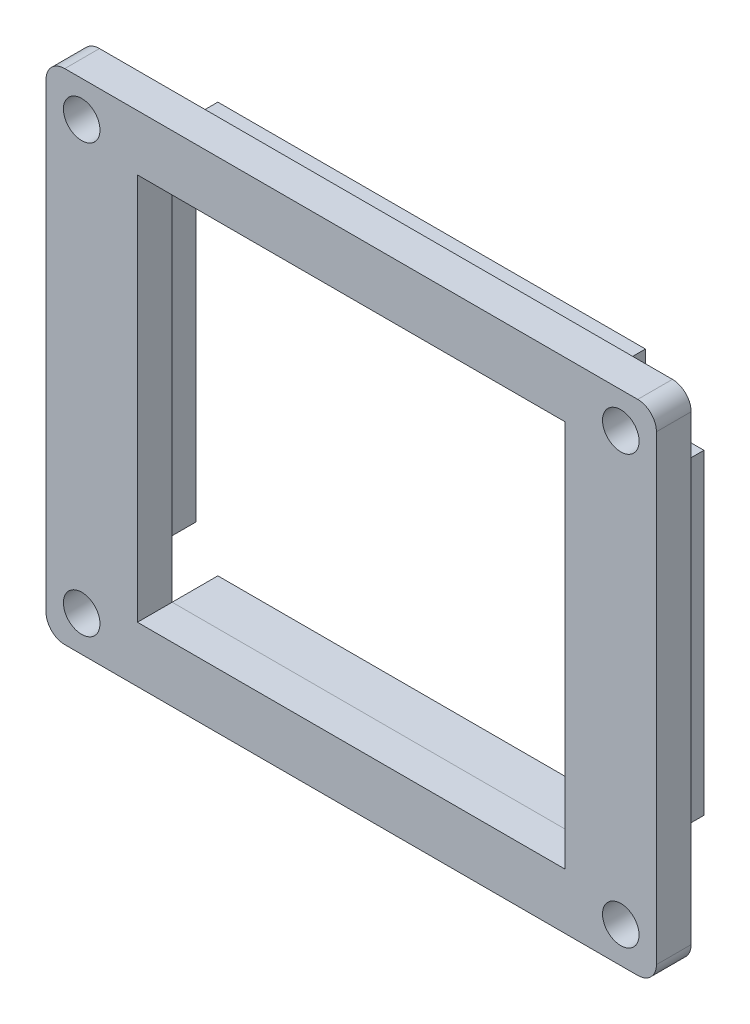
ISO-10303-21;
HEADER;
FILE_DESCRIPTION(('STEP AP214'),'2;1');
FILE_NAME('part.step','',(''),(''),'','','');
FILE_SCHEMA(('AUTOMOTIVE_DESIGN { 1 0 10303 214 1 1 1 1 }'));
ENDSEC;
DATA;
#1=APPLICATION_CONTEXT('core data for automotive mechanical design processes');
#2=APPLICATION_PROTOCOL_DEFINITION('international standard','automotive_design',2000,#1);
#3=PRODUCT_CONTEXT('',#1,'mechanical');
#4=PRODUCT('Part','Part','',(#3));
#5=PRODUCT_RELATED_PRODUCT_CATEGORY('part','',(#4));
#6=PRODUCT_DEFINITION_FORMATION('','',#4);
#7=PRODUCT_DEFINITION_CONTEXT('part definition',#1,'design');
#8=PRODUCT_DEFINITION('design','',#6,#7);
#9=PRODUCT_DEFINITION_SHAPE('','',#8);
#10=(LENGTH_UNIT() NAMED_UNIT(*) SI_UNIT(.MILLI.,.METRE.));
#11=(NAMED_UNIT(*) PLANE_ANGLE_UNIT() SI_UNIT($,.RADIAN.));
#12=(NAMED_UNIT(*) SI_UNIT($,.STERADIAN.) SOLID_ANGLE_UNIT());
#13=UNCERTAINTY_MEASURE_WITH_UNIT(LENGTH_MEASURE(1.E-05),#10,'distance_accuracy_value','');
#14=(GEOMETRIC_REPRESENTATION_CONTEXT(3) GLOBAL_UNCERTAINTY_ASSIGNED_CONTEXT((#13)) GLOBAL_UNIT_ASSIGNED_CONTEXT((#10,
#11,#12)) REPRESENTATION_CONTEXT('',''));
#15=CARTESIAN_POINT('',(0.,0.,0.));
#16=DIRECTION('',(0.,0.,1.));
#17=DIRECTION('',(1.,0.,0.));
#18=AXIS2_PLACEMENT_3D('',#15,#16,#17);
#19=CARTESIAN_POINT('',(0.,0.,-4.826));
#20=DIRECTION('',(0.,0.,-1.));
#21=DIRECTION('',(-1.,0.,0.));
#22=AXIS2_PLACEMENT_3D('',#19,#20,#21);
#23=PLANE('',#22);
#24=DIRECTION('',(0.,1.,0.));
#25=VECTOR('',#24,1.);
#26=CARTESIAN_POINT('',(-29.718,-26.924,-4.826));
#27=LINE('',#26,#25);
#28=CARTESIAN_POINT('',(-29.718,-26.924,-4.826));
#29=VERTEX_POINT('',#28);
#30=CARTESIAN_POINT('',(-29.718,26.924,-4.826));
#31=VERTEX_POINT('',#30);
#32=EDGE_CURVE('E224',#29,#31,#27,.T.);
#33=ORIENTED_EDGE('',*,*,#32,.F.);
#34=DIRECTION('',(0.,1.,0.));
#35=VECTOR('',#34,1.);
#36=CARTESIAN_POINT('',(-29.718,-30.099,-4.826));
#37=LINE('',#36,#35);
#38=CARTESIAN_POINT('',(-29.718,-30.099,-4.826));
#39=VERTEX_POINT('',#38);
#40=EDGE_CURVE('E268',#39,#29,#37,.T.);
#41=ORIENTED_EDGE('',*,*,#40,.F.);
#42=DIRECTION('',(-1.,0.,0.));
#43=VECTOR('',#42,1.);
#44=CARTESIAN_POINT('',(-29.718,-30.099,-4.826));
#45=LINE('',#44,#43);
#46=CARTESIAN_POINT('',(29.718,-30.099,-4.826));
#47=VERTEX_POINT('',#46);
#48=EDGE_CURVE('E284',#47,#39,#45,.T.);
#49=ORIENTED_EDGE('',*,*,#48,.F.);
#50=DIRECTION('',(0.,-1.,0.));
#51=VECTOR('',#50,1.);
#52=CARTESIAN_POINT('',(29.718,-30.099,-4.826));
#53=LINE('',#52,#51);
#54=CARTESIAN_POINT('',(29.718,-26.924,-4.826));
#55=VERTEX_POINT('',#54);
#56=EDGE_CURVE('E281',#55,#47,#53,.T.);
#57=ORIENTED_EDGE('',*,*,#56,.F.);
#58=DIRECTION('',(0.,-1.,0.));
#59=VECTOR('',#58,1.);
#60=CARTESIAN_POINT('',(29.718,-26.924,-4.826));
#61=LINE('',#60,#59);
#62=CARTESIAN_POINT('',(29.718,26.924,-4.826));
#63=VERTEX_POINT('',#62);
#64=EDGE_CURVE('E242',#63,#55,#61,.T.);
#65=ORIENTED_EDGE('',*,*,#64,.F.);
#66=DIRECTION('',(0.,-1.,0.));
#67=VECTOR('',#66,1.);
#68=CARTESIAN_POINT('',(29.718,30.099,-4.826));
#69=LINE('',#68,#67);
#70=CARTESIAN_POINT('',(29.718,30.099,-4.826));
#71=VERTEX_POINT('',#70);
#72=EDGE_CURVE('E349',#71,#63,#69,.T.);
#73=ORIENTED_EDGE('',*,*,#72,.F.);
#74=DIRECTION('',(1.,0.,0.));
#75=VECTOR('',#74,1.);
#76=CARTESIAN_POINT('',(-29.718,30.099,-4.826));
#77=LINE('',#76,#75);
#78=CARTESIAN_POINT('',(-29.718,30.099,-4.826));
#79=VERTEX_POINT('',#78);
#80=EDGE_CURVE('E365',#79,#71,#77,.T.);
#81=ORIENTED_EDGE('',*,*,#80,.F.);
#82=DIRECTION('',(0.,1.,0.));
#83=VECTOR('',#82,1.);
#84=CARTESIAN_POINT('',(-29.718,30.099,-4.826));
#85=LINE('',#84,#83);
#86=EDGE_CURVE('E362',#31,#79,#85,.T.);
#87=ORIENTED_EDGE('',*,*,#86,.F.);
#88=EDGE_LOOP('',(#33,#41,#49,#57,#65,#73,#81,#87));
#89=FACE_BOUND('',#88,.T.);
#90=CARTESIAN_POINT('',(37.465,29.718,-4.826));
#91=DIRECTION('',(0.,0.,1.));
#92=DIRECTION('',(-1.,0.,0.));
#93=AXIS2_PLACEMENT_3D('',#90,#91,#92);
#94=CIRCLE('',#93,2.54);
#95=CARTESIAN_POINT('',(34.925,29.718,-4.826));
#96=VERTEX_POINT('',#95);
#97=EDGE_CURVE('E444',#96,#96,#94,.T.);
#98=ORIENTED_EDGE('',*,*,#97,.T.);
#99=EDGE_LOOP('',(#98));
#100=FACE_BOUND('',#99,.T.);
#101=CARTESIAN_POINT('',(-37.465,-29.718,-4.826));
#102=DIRECTION('',(0.,0.,1.));
#103=DIRECTION('',(-1.,0.,0.));
#104=AXIS2_PLACEMENT_3D('',#101,#102,#103);
#105=CIRCLE('',#104,2.54);
#106=CARTESIAN_POINT('',(-40.005,-29.718,-4.826));
#107=VERTEX_POINT('',#106);
#108=EDGE_CURVE('E436',#107,#107,#105,.T.);
#109=ORIENTED_EDGE('',*,*,#108,.T.);
#110=EDGE_LOOP('',(#109));
#111=FACE_BOUND('',#110,.T.);
#112=CARTESIAN_POINT('',(37.465,-29.718,-4.826));
#113=DIRECTION('',(0.,0.,1.));
#114=DIRECTION('',(1.,0.,0.));
#115=AXIS2_PLACEMENT_3D('',#112,#113,#114);
#116=CIRCLE('',#115,2.54);
#117=CARTESIAN_POINT('',(40.005,-29.718,-4.826));
#118=VERTEX_POINT('',#117);
#119=EDGE_CURVE('E427',#118,#118,#116,.T.);
#120=ORIENTED_EDGE('',*,*,#119,.T.);
#121=EDGE_LOOP('',(#120));
#122=FACE_BOUND('',#121,.T.);
#123=CARTESIAN_POINT('',(-37.465,29.718,-4.826));
#124=DIRECTION('',(0.,0.,1.));
#125=DIRECTION('',(1.,0.,0.));
#126=AXIS2_PLACEMENT_3D('',#123,#124,#125);
#127=CIRCLE('',#126,2.54);
#128=CARTESIAN_POINT('',(-34.925,29.718,-4.826));
#129=VERTEX_POINT('',#128);
#130=EDGE_CURVE('E451',#129,#129,#127,.T.);
#131=ORIENTED_EDGE('',*,*,#130,.T.);
#132=EDGE_LOOP('',(#131));
#133=FACE_BOUND('',#132,.T.);
#134=DIRECTION('',(1.,0.,0.));
#135=VECTOR('',#134,1.);
#136=CARTESIAN_POINT('',(-42.418,-34.671,-4.826));
#137=LINE('',#136,#135);
#138=CARTESIAN_POINT('',(-39.818,-34.671,-4.826));
#139=VERTEX_POINT('',#138);
#140=CARTESIAN_POINT('',(39.818,-34.671,-4.826));
#141=VERTEX_POINT('',#140);
#142=EDGE_CURVE('E463',#139,#141,#137,.T.);
#143=ORIENTED_EDGE('',*,*,#142,.F.);
#144=CARTESIAN_POINT('',(-39.818,-32.071,-4.826));
#145=DIRECTION('',(0.,0.,-1.));
#146=DIRECTION('',(-1.,0.,0.));
#147=AXIS2_PLACEMENT_3D('',#144,#145,#146);
#148=CIRCLE('',#147,2.6);
#149=CARTESIAN_POINT('',(-42.418,-32.071,-4.826));
#150=VERTEX_POINT('',#149);
#151=EDGE_CURVE('E525',#139,#150,#148,.T.);
#152=ORIENTED_EDGE('',*,*,#151,.T.);
#153=DIRECTION('',(0.,-1.,0.));
#154=VECTOR('',#153,1.);
#155=CARTESIAN_POINT('',(-42.418,-34.671,-4.826));
#156=LINE('',#155,#154);
#157=CARTESIAN_POINT('',(-42.418,32.071,-4.826));
#158=VERTEX_POINT('',#157);
#159=EDGE_CURVE('E459',#158,#150,#156,.T.);
#160=ORIENTED_EDGE('',*,*,#159,.F.);
#161=CARTESIAN_POINT('',(-39.818,32.071,-4.826));
#162=DIRECTION('',(0.,0.,-1.));
#163=DIRECTION('',(-1.,0.,0.));
#164=AXIS2_PLACEMENT_3D('',#161,#162,#163);
#165=CIRCLE('',#164,2.6);
#166=CARTESIAN_POINT('',(-39.818,34.671,-4.826));
#167=VERTEX_POINT('',#166);
#168=EDGE_CURVE('E516',#158,#167,#165,.T.);
#169=ORIENTED_EDGE('',*,*,#168,.T.);
#170=DIRECTION('',(-1.,0.,0.));
#171=VECTOR('',#170,1.);
#172=CARTESIAN_POINT('',(-42.418,34.671,-4.826));
#173=LINE('',#172,#171);
#174=CARTESIAN_POINT('',(39.818,34.671,-4.826));
#175=VERTEX_POINT('',#174);
#176=EDGE_CURVE('E472',#175,#167,#173,.T.);
#177=ORIENTED_EDGE('',*,*,#176,.F.);
#178=CARTESIAN_POINT('',(39.818,32.071,-4.826));
#179=DIRECTION('',(0.,0.,-1.));
#180=DIRECTION('',(-1.,0.,0.));
#181=AXIS2_PLACEMENT_3D('',#178,#179,#180);
#182=CIRCLE('',#181,2.6);
#183=CARTESIAN_POINT('',(42.418,32.071,-4.826));
#184=VERTEX_POINT('',#183);
#185=EDGE_CURVE('E519',#175,#184,#182,.T.);
#186=ORIENTED_EDGE('',*,*,#185,.T.);
#187=DIRECTION('',(0.,1.,0.));
#188=VECTOR('',#187,1.);
#189=CARTESIAN_POINT('',(42.418,-34.671,-4.826));
#190=LINE('',#189,#188);
#191=CARTESIAN_POINT('',(42.418,-32.071,-4.826));
#192=VERTEX_POINT('',#191);
#193=EDGE_CURVE('E468',#192,#184,#190,.T.);
#194=ORIENTED_EDGE('',*,*,#193,.F.);
#195=CARTESIAN_POINT('',(39.818,-32.071,-4.826));
#196=DIRECTION('',(0.,0.,-1.));
#197=DIRECTION('',(-1.,0.,0.));
#198=AXIS2_PLACEMENT_3D('',#195,#196,#197);
#199=CIRCLE('',#198,2.6);
#200=EDGE_CURVE('E522',#192,#141,#199,.T.);
#201=ORIENTED_EDGE('',*,*,#200,.T.);
#202=EDGE_LOOP('',(#143,#152,#160,#169,#177,#186,#194,#201));
#203=FACE_BOUND('',#202,.T.);
#204=DIRECTION('',(0.,1.,0.));
#205=VECTOR('',#204,1.);
#206=CARTESIAN_POINT('',(35.052,21.971,-4.826));
#207=LINE('',#206,#205);
#208=CARTESIAN_POINT('',(35.052,-21.971,-4.826));
#209=VERTEX_POINT('',#208);
#210=CARTESIAN_POINT('',(35.052,21.971,-4.826));
#211=VERTEX_POINT('',#210);
#212=EDGE_CURVE('E404',#209,#211,#207,.T.);
#213=ORIENTED_EDGE('',*,*,#212,.F.);
#214=DIRECTION('',(-1.,0.,0.));
#215=VECTOR('',#214,1.);
#216=CARTESIAN_POINT('',(37.846,-21.971,-4.826));
#217=LINE('',#216,#215);
#218=CARTESIAN_POINT('',(37.846,-21.971,-4.826));
#219=VERTEX_POINT('',#218);
#220=EDGE_CURVE('E385',#219,#209,#217,.T.);
#221=ORIENTED_EDGE('',*,*,#220,.F.);
#222=DIRECTION('',(0.,-1.,0.));
#223=VECTOR('',#222,1.);
#224=CARTESIAN_POINT('',(37.846,21.971,-4.826));
#225=LINE('',#224,#223);
#226=CARTESIAN_POINT('',(37.846,21.971,-4.826));
#227=VERTEX_POINT('',#226);
#228=EDGE_CURVE('E391',#227,#219,#225,.T.);
#229=ORIENTED_EDGE('',*,*,#228,.F.);
#230=DIRECTION('',(1.,0.,0.));
#231=VECTOR('',#230,1.);
#232=CARTESIAN_POINT('',(37.846,21.971,-4.826));
#233=LINE('',#232,#231);
#234=EDGE_CURVE('E407',#211,#227,#233,.T.);
#235=ORIENTED_EDGE('',*,*,#234,.F.);
#236=EDGE_LOOP('',(#213,#221,#229,#235));
#237=FACE_BOUND('',#236,.T.);
#238=DIRECTION('',(0.,-1.,0.));
#239=VECTOR('',#238,1.);
#240=CARTESIAN_POINT('',(-32.766,21.971,-4.826));
#241=LINE('',#240,#239);
#242=CARTESIAN_POINT('',(-32.766,21.971,-4.826));
#243=VERTEX_POINT('',#242);
#244=CARTESIAN_POINT('',(-32.766,-21.971,-4.826));
#245=VERTEX_POINT('',#244);
#246=EDGE_CURVE('E321',#243,#245,#241,.T.);
#247=ORIENTED_EDGE('',*,*,#246,.F.);
#248=DIRECTION('',(1.,0.,0.));
#249=VECTOR('',#248,1.);
#250=CARTESIAN_POINT('',(-37.846,21.971,-4.826));
#251=LINE('',#250,#249);
#252=CARTESIAN_POINT('',(-37.846,21.971,-4.826));
#253=VERTEX_POINT('',#252);
#254=EDGE_CURVE('E302',#253,#243,#251,.T.);
#255=ORIENTED_EDGE('',*,*,#254,.F.);
#256=DIRECTION('',(0.,1.,0.));
#257=VECTOR('',#256,1.);
#258=CARTESIAN_POINT('',(-37.846,21.971,-4.826));
#259=LINE('',#258,#257);
#260=CARTESIAN_POINT('',(-37.846,-21.971,-4.826));
#261=VERTEX_POINT('',#260);
#262=EDGE_CURVE('E308',#261,#253,#259,.T.);
#263=ORIENTED_EDGE('',*,*,#262,.F.);
#264=DIRECTION('',(-1.,0.,0.));
#265=VECTOR('',#264,1.);
#266=CARTESIAN_POINT('',(-37.846,-21.971,-4.826));
#267=LINE('',#266,#265);
#268=EDGE_CURVE('E324',#245,#261,#267,.T.);
#269=ORIENTED_EDGE('',*,*,#268,.F.);
#270=EDGE_LOOP('',(#247,#255,#263,#269));
#271=FACE_BOUND('',#270,.T.);
#272=ADVANCED_FACE('F42',(#89,#100,#111,#122,#133,#203,#237,#271),#23,.T.);
#273=CARTESIAN_POINT('',(-42.418,-34.671,-4.826));
#274=DIRECTION('',(-1.,0.,0.));
#275=DIRECTION('',(0.,0.,1.));
#276=AXIS2_PLACEMENT_3D('',#273,#274,#275);
#277=PLANE('',#276);
#278=ORIENTED_EDGE('',*,*,#159,.T.);
#279=DIRECTION('',(0.,0.,1.));
#280=VECTOR('',#279,1.);
#281=CARTESIAN_POINT('',(-42.418,-32.071,-4.826));
#282=LINE('',#281,#280);
#283=CARTESIAN_POINT('',(-42.418,-32.071,0.));
#284=VERTEX_POINT('',#283);
#285=EDGE_CURVE('E493',#150,#284,#282,.T.);
#286=ORIENTED_EDGE('',*,*,#285,.T.);
#287=DIRECTION('',(0.,-1.,0.));
#288=VECTOR('',#287,1.);
#289=CARTESIAN_POINT('',(-42.418,-34.671,0.));
#290=LINE('',#289,#288);
#291=CARTESIAN_POINT('',(-42.418,32.071,0.));
#292=VERTEX_POINT('',#291);
#293=EDGE_CURVE('E455',#292,#284,#290,.T.);
#294=ORIENTED_EDGE('',*,*,#293,.F.);
#295=DIRECTION('',(0.,0.,1.));
#296=VECTOR('',#295,1.);
#297=CARTESIAN_POINT('',(-42.418,32.071,-4.826));
#298=LINE('',#297,#296);
#299=EDGE_CURVE('E476',#292,#158,#298,.F.);
#300=ORIENTED_EDGE('',*,*,#299,.T.);
#301=EDGE_LOOP('',(#278,#286,#294,#300));
#302=FACE_BOUND('',#301,.T.);
#303=ADVANCED_FACE('F571',(#302),#277,.T.);
#304=CARTESIAN_POINT('',(-42.418,34.671,-4.826));
#305=DIRECTION('',(0.,1.,0.));
#306=DIRECTION('',(0.,0.,1.));
#307=AXIS2_PLACEMENT_3D('',#304,#305,#306);
#308=PLANE('',#307);
#309=DIRECTION('',(-1.,0.,0.));
#310=VECTOR('',#309,1.);
#311=CARTESIAN_POINT('',(-42.418,34.671,0.));
#312=LINE('',#311,#310);
#313=CARTESIAN_POINT('',(39.818,34.671,0.));
#314=VERTEX_POINT('',#313);
#315=CARTESIAN_POINT('',(-39.818,34.671,0.));
#316=VERTEX_POINT('',#315);
#317=EDGE_CURVE('E464',#314,#316,#312,.T.);
#318=ORIENTED_EDGE('',*,*,#317,.F.);
#319=DIRECTION('',(0.,0.,1.));
#320=VECTOR('',#319,1.);
#321=CARTESIAN_POINT('',(39.818,34.671,-4.826));
#322=LINE('',#321,#320);
#323=EDGE_CURVE('E11',#314,#175,#322,.F.);
#324=ORIENTED_EDGE('',*,*,#323,.T.);
#325=ORIENTED_EDGE('',*,*,#176,.T.);
#326=DIRECTION('',(0.,0.,1.));
#327=VECTOR('',#326,1.);
#328=CARTESIAN_POINT('',(-39.818,34.671,-4.826));
#329=LINE('',#328,#327);
#330=EDGE_CURVE('E51',#167,#316,#329,.T.);
#331=ORIENTED_EDGE('',*,*,#330,.T.);
#332=EDGE_LOOP('',(#318,#324,#325,#331));
#333=FACE_BOUND('',#332,.T.);
#334=ADVANCED_FACE('F539',(#333),#308,.T.);
#335=CARTESIAN_POINT('',(42.418,-34.671,-4.826));
#336=DIRECTION('',(1.,0.,0.));
#337=DIRECTION('',(0.,0.,-1.));
#338=AXIS2_PLACEMENT_3D('',#335,#336,#337);
#339=PLANE('',#338);
#340=DIRECTION('',(0.,1.,0.));
#341=VECTOR('',#340,1.);
#342=CARTESIAN_POINT('',(42.418,-34.671,0.));
#343=LINE('',#342,#341);
#344=CARTESIAN_POINT('',(42.418,-32.071,0.));
#345=VERTEX_POINT('',#344);
#346=CARTESIAN_POINT('',(42.418,32.071,0.));
#347=VERTEX_POINT('',#346);
#348=EDGE_CURVE('E484',#345,#347,#343,.T.);
#349=ORIENTED_EDGE('',*,*,#348,.F.);
#350=DIRECTION('',(0.,0.,1.));
#351=VECTOR('',#350,1.);
#352=CARTESIAN_POINT('',(42.418,-32.071,-4.826));
#353=LINE('',#352,#351);
#354=EDGE_CURVE('E532',#345,#192,#353,.F.);
#355=ORIENTED_EDGE('',*,*,#354,.T.);
#356=ORIENTED_EDGE('',*,*,#193,.T.);
#357=DIRECTION('',(0.,0.,1.));
#358=VECTOR('',#357,1.);
#359=CARTESIAN_POINT('',(42.418,32.071,-4.826));
#360=LINE('',#359,#358);
#361=EDGE_CURVE('E528',#184,#347,#360,.T.);
#362=ORIENTED_EDGE('',*,*,#361,.T.);
#363=EDGE_LOOP('',(#349,#355,#356,#362));
#364=FACE_BOUND('',#363,.T.);
#365=ADVANCED_FACE('F552',(#364),#339,.T.);
#366=CARTESIAN_POINT('',(-42.418,-34.671,-4.826));
#367=DIRECTION('',(0.,-1.,0.));
#368=DIRECTION('',(0.,0.,-1.));
#369=AXIS2_PLACEMENT_3D('',#366,#367,#368);
#370=PLANE('',#369);
#371=DIRECTION('',(1.,0.,0.));
#372=VECTOR('',#371,1.);
#373=CARTESIAN_POINT('',(-42.418,-34.671,0.));
#374=LINE('',#373,#372);
#375=CARTESIAN_POINT('',(-39.818,-34.671,0.));
#376=VERTEX_POINT('',#375);
#377=CARTESIAN_POINT('',(39.818,-34.671,0.));
#378=VERTEX_POINT('',#377);
#379=EDGE_CURVE('E480',#376,#378,#374,.T.);
#380=ORIENTED_EDGE('',*,*,#379,.F.);
#381=DIRECTION('',(0.,0.,1.));
#382=VECTOR('',#381,1.);
#383=CARTESIAN_POINT('',(-39.818,-34.671,-4.826));
#384=LINE('',#383,#382);
#385=EDGE_CURVE('E513',#376,#139,#384,.F.);
#386=ORIENTED_EDGE('',*,*,#385,.T.);
#387=ORIENTED_EDGE('',*,*,#142,.T.);
#388=DIRECTION('',(0.,0.,1.));
#389=VECTOR('',#388,1.);
#390=CARTESIAN_POINT('',(39.818,-34.671,-4.826));
#391=LINE('',#390,#389);
#392=EDGE_CURVE('E509',#141,#378,#391,.T.);
#393=ORIENTED_EDGE('',*,*,#392,.T.);
#394=EDGE_LOOP('',(#380,#386,#387,#393));
#395=FACE_BOUND('',#394,.T.);
#396=ADVANCED_FACE('F564',(#395),#370,.T.);
#397=CARTESIAN_POINT('',(0.,0.,0.));
#398=DIRECTION('',(0.,0.,-1.));
#399=DIRECTION('',(-1.,0.,0.));
#400=AXIS2_PLACEMENT_3D('',#397,#398,#399);
#401=PLANE('',#400);
#402=DIRECTION('',(-1.,0.,0.));
#403=VECTOR('',#402,1.);
#404=CARTESIAN_POINT('',(29.718,-26.924,0.));
#405=LINE('',#404,#403);
#406=CARTESIAN_POINT('',(29.718,-26.924,0.));
#407=VERTEX_POINT('',#406);
#408=CARTESIAN_POINT('',(-29.718,-26.924,0.));
#409=VERTEX_POINT('',#408);
#410=EDGE_CURVE('E230',#407,#409,#405,.T.);
#411=ORIENTED_EDGE('',*,*,#410,.T.);
#412=DIRECTION('',(0.,1.,0.));
#413=VECTOR('',#412,1.);
#414=CARTESIAN_POINT('',(-29.718,-26.924,0.));
#415=LINE('',#414,#413);
#416=CARTESIAN_POINT('',(-29.718,26.924,0.));
#417=VERTEX_POINT('',#416);
#418=EDGE_CURVE('E221',#409,#417,#415,.T.);
#419=ORIENTED_EDGE('',*,*,#418,.T.);
#420=DIRECTION('',(1.,0.,0.));
#421=VECTOR('',#420,1.);
#422=CARTESIAN_POINT('',(29.718,26.924,0.));
#423=LINE('',#422,#421);
#424=CARTESIAN_POINT('',(29.718,26.924,0.));
#425=VERTEX_POINT('',#424);
#426=EDGE_CURVE('E233',#417,#425,#423,.T.);
#427=ORIENTED_EDGE('',*,*,#426,.T.);
#428=DIRECTION('',(0.,-1.,0.));
#429=VECTOR('',#428,1.);
#430=CARTESIAN_POINT('',(29.718,-26.924,0.));
#431=LINE('',#430,#429);
#432=EDGE_CURVE('E58',#425,#407,#431,.T.);
#433=ORIENTED_EDGE('',*,*,#432,.T.);
#434=EDGE_LOOP('',(#411,#419,#427,#433));
#435=FACE_BOUND('',#434,.T.);
#436=CARTESIAN_POINT('',(37.465,29.718,0.));
#437=DIRECTION('',(0.,0.,1.));
#438=DIRECTION('',(-1.,0.,0.));
#439=AXIS2_PLACEMENT_3D('',#436,#437,#438);
#440=CIRCLE('',#439,2.54);
#441=CARTESIAN_POINT('',(34.925,29.718,0.));
#442=VERTEX_POINT('',#441);
#443=EDGE_CURVE('E426',#442,#442,#440,.T.);
#444=ORIENTED_EDGE('',*,*,#443,.F.);
#445=EDGE_LOOP('',(#444));
#446=FACE_BOUND('',#445,.T.);
#447=CARTESIAN_POINT('',(-37.465,-29.718,0.));
#448=DIRECTION('',(0.,0.,1.));
#449=DIRECTION('',(-1.,0.,0.));
#450=AXIS2_PLACEMENT_3D('',#447,#448,#449);
#451=CIRCLE('',#450,2.54);
#452=CARTESIAN_POINT('',(-40.005,-29.718,0.));
#453=VERTEX_POINT('',#452);
#454=EDGE_CURVE('E440',#453,#453,#451,.T.);
#455=ORIENTED_EDGE('',*,*,#454,.F.);
#456=EDGE_LOOP('',(#455));
#457=FACE_BOUND('',#456,.T.);
#458=CARTESIAN_POINT('',(37.465,-29.718,0.));
#459=DIRECTION('',(0.,0.,1.));
#460=DIRECTION('',(1.,0.,0.));
#461=AXIS2_PLACEMENT_3D('',#458,#459,#460);
#462=CIRCLE('',#461,2.54);
#463=CARTESIAN_POINT('',(40.005,-29.718,0.));
#464=VERTEX_POINT('',#463);
#465=EDGE_CURVE('E432',#464,#464,#462,.T.);
#466=ORIENTED_EDGE('',*,*,#465,.F.);
#467=EDGE_LOOP('',(#466));
#468=FACE_BOUND('',#467,.T.);
#469=CARTESIAN_POINT('',(-37.465,29.718,0.));
#470=DIRECTION('',(0.,0.,1.));
#471=DIRECTION('',(1.,0.,0.));
#472=AXIS2_PLACEMENT_3D('',#469,#470,#471);
#473=CIRCLE('',#472,2.54);
#474=CARTESIAN_POINT('',(-34.925,29.718,0.));
#475=VERTEX_POINT('',#474);
#476=EDGE_CURVE('E431',#475,#475,#473,.T.);
#477=ORIENTED_EDGE('',*,*,#476,.F.);
#478=EDGE_LOOP('',(#477));
#479=FACE_BOUND('',#478,.T.);
#480=ORIENTED_EDGE('',*,*,#293,.T.);
#481=CARTESIAN_POINT('',(-39.818,-32.071,0.));
#482=DIRECTION('',(0.,0.,-1.));
#483=DIRECTION('',(-1.,0.,0.));
#484=AXIS2_PLACEMENT_3D('',#481,#482,#483);
#485=CIRCLE('',#484,2.6);
#486=EDGE_CURVE('E506',#284,#376,#485,.F.);
#487=ORIENTED_EDGE('',*,*,#486,.T.);
#488=ORIENTED_EDGE('',*,*,#379,.T.);
#489=CARTESIAN_POINT('',(39.818,-32.071,0.));
#490=DIRECTION('',(0.,0.,-1.));
#491=DIRECTION('',(-1.,0.,0.));
#492=AXIS2_PLACEMENT_3D('',#489,#490,#491);
#493=CIRCLE('',#492,2.6);
#494=EDGE_CURVE('E503',#378,#345,#493,.F.);
#495=ORIENTED_EDGE('',*,*,#494,.T.);
#496=ORIENTED_EDGE('',*,*,#348,.T.);
#497=CARTESIAN_POINT('',(39.818,32.071,0.));
#498=DIRECTION('',(0.,0.,-1.));
#499=DIRECTION('',(-1.,0.,0.));
#500=AXIS2_PLACEMENT_3D('',#497,#498,#499);
#501=CIRCLE('',#500,2.6);
#502=EDGE_CURVE('E500',#347,#314,#501,.F.);
#503=ORIENTED_EDGE('',*,*,#502,.T.);
#504=ORIENTED_EDGE('',*,*,#317,.T.);
#505=CARTESIAN_POINT('',(-39.818,32.071,0.));
#506=DIRECTION('',(0.,0.,-1.));
#507=DIRECTION('',(-1.,0.,0.));
#508=AXIS2_PLACEMENT_3D('',#505,#506,#507);
#509=CIRCLE('',#508,2.6);
#510=EDGE_CURVE('E497',#316,#292,#509,.F.);
#511=ORIENTED_EDGE('',*,*,#510,.T.);
#512=EDGE_LOOP('',(#480,#487,#488,#495,#496,#503,#504,#511));
#513=FACE_BOUND('',#512,.T.);
#514=ADVANCED_FACE('F238',(#435,#446,#457,#468,#479,#513),#401,.F.);
#515=CARTESIAN_POINT('',(-37.465,29.718,-4.826));
#516=DIRECTION('',(0.,0.,1.));
#517=DIRECTION('',(1.,0.,0.));
#518=AXIS2_PLACEMENT_3D('',#515,#516,#517);
#519=CYLINDRICAL_SURFACE('',#518,2.54);
#520=ORIENTED_EDGE('',*,*,#130,.F.);
#521=EDGE_LOOP('',(#520));
#522=FACE_BOUND('',#521,.T.);
#523=ORIENTED_EDGE('',*,*,#476,.T.);
#524=EDGE_LOOP('',(#523));
#525=FACE_BOUND('',#524,.T.);
#526=ADVANCED_FACE('F595',(#522,#525),#519,.F.);
#527=CARTESIAN_POINT('',(37.465,-29.718,-4.826));
#528=DIRECTION('',(0.,0.,1.));
#529=DIRECTION('',(1.,0.,0.));
#530=AXIS2_PLACEMENT_3D('',#527,#528,#529);
#531=CYLINDRICAL_SURFACE('',#530,2.54);
#532=ORIENTED_EDGE('',*,*,#119,.F.);
#533=EDGE_LOOP('',(#532));
#534=FACE_BOUND('',#533,.T.);
#535=ORIENTED_EDGE('',*,*,#465,.T.);
#536=EDGE_LOOP('',(#535));
#537=FACE_BOUND('',#536,.T.);
#538=ADVANCED_FACE('F841',(#534,#537),#531,.F.);
#539=CARTESIAN_POINT('',(-37.465,-29.718,-4.826));
#540=DIRECTION('',(0.,0.,1.));
#541=DIRECTION('',(1.,0.,0.));
#542=AXIS2_PLACEMENT_3D('',#539,#540,#541);
#543=CYLINDRICAL_SURFACE('',#542,2.54);
#544=ORIENTED_EDGE('',*,*,#108,.F.);
#545=EDGE_LOOP('',(#544));
#546=FACE_BOUND('',#545,.T.);
#547=ORIENTED_EDGE('',*,*,#454,.T.);
#548=EDGE_LOOP('',(#547));
#549=FACE_BOUND('',#548,.T.);
#550=ADVANCED_FACE('F831',(#546,#549),#543,.F.);
#551=CARTESIAN_POINT('',(37.465,29.718,-4.826));
#552=DIRECTION('',(0.,0.,1.));
#553=DIRECTION('',(1.,0.,0.));
#554=AXIS2_PLACEMENT_3D('',#551,#552,#553);
#555=CYLINDRICAL_SURFACE('',#554,2.54);
#556=ORIENTED_EDGE('',*,*,#97,.F.);
#557=EDGE_LOOP('',(#556));
#558=FACE_BOUND('',#557,.T.);
#559=ORIENTED_EDGE('',*,*,#443,.T.);
#560=EDGE_LOOP('',(#559));
#561=FACE_BOUND('',#560,.T.);
#562=ADVANCED_FACE('F606',(#558,#561),#555,.F.);
#563=CARTESIAN_POINT('',(-39.818,-32.071,-4.826));
#564=DIRECTION('',(0.,0.,1.));
#565=DIRECTION('',(1.,0.,0.));
#566=AXIS2_PLACEMENT_3D('',#563,#564,#565);
#567=CYLINDRICAL_SURFACE('',#566,2.6);
#568=ORIENTED_EDGE('',*,*,#151,.F.);
#569=ORIENTED_EDGE('',*,*,#385,.F.);
#570=ORIENTED_EDGE('',*,*,#486,.F.);
#571=ORIENTED_EDGE('',*,*,#285,.F.);
#572=EDGE_LOOP('',(#568,#569,#570,#571));
#573=FACE_BOUND('',#572,.T.);
#574=ADVANCED_FACE('F569',(#573),#567,.T.);
#575=CARTESIAN_POINT('',(39.818,-32.071,-4.826));
#576=DIRECTION('',(0.,0.,1.));
#577=DIRECTION('',(1.,0.,0.));
#578=AXIS2_PLACEMENT_3D('',#575,#576,#577);
#579=CYLINDRICAL_SURFACE('',#578,2.6);
#580=ORIENTED_EDGE('',*,*,#200,.F.);
#581=ORIENTED_EDGE('',*,*,#354,.F.);
#582=ORIENTED_EDGE('',*,*,#494,.F.);
#583=ORIENTED_EDGE('',*,*,#392,.F.);
#584=EDGE_LOOP('',(#580,#581,#582,#583));
#585=FACE_BOUND('',#584,.T.);
#586=ADVANCED_FACE('F561',(#585),#579,.T.);
#587=CARTESIAN_POINT('',(39.818,32.071,-4.826));
#588=DIRECTION('',(0.,0.,1.));
#589=DIRECTION('',(1.,0.,0.));
#590=AXIS2_PLACEMENT_3D('',#587,#588,#589);
#591=CYLINDRICAL_SURFACE('',#590,2.6);
#592=ORIENTED_EDGE('',*,*,#185,.F.);
#593=ORIENTED_EDGE('',*,*,#323,.F.);
#594=ORIENTED_EDGE('',*,*,#502,.F.);
#595=ORIENTED_EDGE('',*,*,#361,.F.);
#596=EDGE_LOOP('',(#592,#593,#594,#595));
#597=FACE_BOUND('',#596,.T.);
#598=ADVANCED_FACE('F550',(#597),#591,.T.);
#599=CARTESIAN_POINT('',(-39.818,32.071,-4.826));
#600=DIRECTION('',(0.,0.,1.));
#601=DIRECTION('',(1.,0.,0.));
#602=AXIS2_PLACEMENT_3D('',#599,#600,#601);
#603=CYLINDRICAL_SURFACE('',#602,2.6);
#604=ORIENTED_EDGE('',*,*,#168,.F.);
#605=ORIENTED_EDGE('',*,*,#299,.F.);
#606=ORIENTED_EDGE('',*,*,#510,.F.);
#607=ORIENTED_EDGE('',*,*,#330,.F.);
#608=EDGE_LOOP('',(#604,#605,#606,#607));
#609=FACE_BOUND('',#608,.T.);
#610=ADVANCED_FACE('F44',(#609),#603,.T.);
#611=CARTESIAN_POINT('',(37.846,-21.971,-11.176));
#612=DIRECTION('',(0.,1.,0.));
#613=DIRECTION('',(0.,0.,1.));
#614=AXIS2_PLACEMENT_3D('',#611,#612,#613);
#615=PLANE('',#614);
#616=ORIENTED_EDGE('',*,*,#220,.T.);
#617=DIRECTION('',(0.,0.,1.));
#618=VECTOR('',#617,1.);
#619=CARTESIAN_POINT('',(35.052,-21.971,-11.176));
#620=LINE('',#619,#618);
#621=CARTESIAN_POINT('',(35.052,-21.971,-11.176));
#622=VERTEX_POINT('',#621);
#623=EDGE_CURVE('E423',#622,#209,#620,.T.);
#624=ORIENTED_EDGE('',*,*,#623,.F.);
#625=DIRECTION('',(-1.,0.,0.));
#626=VECTOR('',#625,1.);
#627=CARTESIAN_POINT('',(37.846,-21.971,-11.176));
#628=LINE('',#627,#626);
#629=CARTESIAN_POINT('',(37.846,-21.971,-11.176));
#630=VERTEX_POINT('',#629);
#631=EDGE_CURVE('E386',#630,#622,#628,.T.);
#632=ORIENTED_EDGE('',*,*,#631,.F.);
#633=DIRECTION('',(0.,0.,1.));
#634=VECTOR('',#633,1.);
#635=CARTESIAN_POINT('',(37.846,-21.971,-11.176));
#636=LINE('',#635,#634);
#637=EDGE_CURVE('E400',#630,#219,#636,.T.);
#638=ORIENTED_EDGE('',*,*,#637,.T.);
#639=EDGE_LOOP('',(#616,#624,#632,#638));
#640=FACE_BOUND('',#639,.T.);
#641=ADVANCED_FACE('F575',(#640),#615,.F.);
#642=CARTESIAN_POINT('',(35.052,21.971,-11.176));
#643=DIRECTION('',(1.,0.,0.));
#644=DIRECTION('',(0.,1.,0.));
#645=AXIS2_PLACEMENT_3D('',#642,#643,#644);
#646=PLANE('',#645);
#647=ORIENTED_EDGE('',*,*,#212,.T.);
#648=DIRECTION('',(0.,0.,1.));
#649=VECTOR('',#648,1.);
#650=CARTESIAN_POINT('',(35.052,21.971,-11.176));
#651=LINE('',#650,#649);
#652=CARTESIAN_POINT('',(35.052,21.971,-11.176));
#653=VERTEX_POINT('',#652);
#654=EDGE_CURVE('E419',#653,#211,#651,.T.);
#655=ORIENTED_EDGE('',*,*,#654,.F.);
#656=DIRECTION('',(0.,1.,0.));
#657=VECTOR('',#656,1.);
#658=CARTESIAN_POINT('',(35.052,21.971,-11.176));
#659=LINE('',#658,#657);
#660=EDGE_CURVE('E390',#622,#653,#659,.T.);
#661=ORIENTED_EDGE('',*,*,#660,.F.);
#662=ORIENTED_EDGE('',*,*,#623,.T.);
#663=EDGE_LOOP('',(#647,#655,#661,#662));
#664=FACE_BOUND('',#663,.T.);
#665=ADVANCED_FACE('F581',(#664),#646,.F.);
#666=CARTESIAN_POINT('',(37.846,21.971,-11.176));
#667=DIRECTION('',(0.,-1.,0.));
#668=DIRECTION('',(0.,0.,-1.));
#669=AXIS2_PLACEMENT_3D('',#666,#667,#668);
#670=PLANE('',#669);
#671=ORIENTED_EDGE('',*,*,#234,.T.);
#672=DIRECTION('',(0.,0.,1.));
#673=VECTOR('',#672,1.);
#674=CARTESIAN_POINT('',(37.846,21.971,-11.176));
#675=LINE('',#674,#673);
#676=CARTESIAN_POINT('',(37.846,21.971,-11.176));
#677=VERTEX_POINT('',#676);
#678=EDGE_CURVE('E416',#677,#227,#675,.T.);
#679=ORIENTED_EDGE('',*,*,#678,.F.);
#680=DIRECTION('',(1.,0.,0.));
#681=VECTOR('',#680,1.);
#682=CARTESIAN_POINT('',(37.846,21.971,-11.176));
#683=LINE('',#682,#681);
#684=EDGE_CURVE('E394',#653,#677,#683,.T.);
#685=ORIENTED_EDGE('',*,*,#684,.F.);
#686=ORIENTED_EDGE('',*,*,#654,.T.);
#687=EDGE_LOOP('',(#671,#679,#685,#686));
#688=FACE_BOUND('',#687,.T.);
#689=ADVANCED_FACE('F637',(#688),#670,.F.);
#690=CARTESIAN_POINT('',(37.846,21.971,-11.176));
#691=DIRECTION('',(-1.,0.,0.));
#692=DIRECTION('',(0.,-1.,0.));
#693=AXIS2_PLACEMENT_3D('',#690,#691,#692);
#694=PLANE('',#693);
#695=ORIENTED_EDGE('',*,*,#228,.T.);
#696=ORIENTED_EDGE('',*,*,#637,.F.);
#697=DIRECTION('',(0.,-1.,0.));
#698=VECTOR('',#697,1.);
#699=CARTESIAN_POINT('',(37.846,21.971,-11.176));
#700=LINE('',#699,#698);
#701=EDGE_CURVE('E397',#677,#630,#700,.T.);
#702=ORIENTED_EDGE('',*,*,#701,.F.);
#703=ORIENTED_EDGE('',*,*,#678,.T.);
#704=EDGE_LOOP('',(#695,#696,#702,#703));
#705=FACE_BOUND('',#704,.T.);
#706=ADVANCED_FACE('F647',(#705),#694,.F.);
#707=CARTESIAN_POINT('',(0.,0.,-11.176));
#708=DIRECTION('',(0.,0.,1.));
#709=DIRECTION('',(1.,0.,0.));
#710=AXIS2_PLACEMENT_3D('',#707,#708,#709);
#711=PLANE('',#710);
#712=ORIENTED_EDGE('',*,*,#631,.T.);
#713=ORIENTED_EDGE('',*,*,#660,.T.);
#714=ORIENTED_EDGE('',*,*,#684,.T.);
#715=ORIENTED_EDGE('',*,*,#701,.T.);
#716=EDGE_LOOP('',(#712,#713,#714,#715));
#717=FACE_BOUND('',#716,.T.);
#718=ADVANCED_FACE('F657',(#717),#711,.F.);
#719=CARTESIAN_POINT('',(-29.718,26.924,-11.176));
#720=DIRECTION('',(0.,1.,0.));
#721=DIRECTION('',(-1.,0.,0.));
#722=AXIS2_PLACEMENT_3D('',#719,#720,#721);
#723=PLANE('',#722);
#724=DIRECTION('',(-1.,0.,0.));
#725=VECTOR('',#724,1.);
#726=CARTESIAN_POINT('',(-29.718,26.924,-4.826));
#727=LINE('',#726,#725);
#728=EDGE_CURVE('E343',#63,#31,#727,.T.);
#729=ORIENTED_EDGE('',*,*,#728,.T.);
#730=DIRECTION('',(0.,0.,1.));
#731=VECTOR('',#730,1.);
#732=CARTESIAN_POINT('',(-29.718,26.924,-11.176));
#733=LINE('',#732,#731);
#734=CARTESIAN_POINT('',(-29.718,26.924,-11.176));
#735=VERTEX_POINT('',#734);
#736=EDGE_CURVE('E382',#735,#31,#733,.T.);
#737=ORIENTED_EDGE('',*,*,#736,.F.);
#738=DIRECTION('',(-1.,0.,0.));
#739=VECTOR('',#738,1.);
#740=CARTESIAN_POINT('',(-29.718,26.924,-11.176));
#741=LINE('',#740,#739);
#742=CARTESIAN_POINT('',(29.718,26.924,-11.176));
#743=VERTEX_POINT('',#742);
#744=EDGE_CURVE('E344',#743,#735,#741,.T.);
#745=ORIENTED_EDGE('',*,*,#744,.F.);
#746=DIRECTION('',(0.,0.,1.));
#747=VECTOR('',#746,1.);
#748=CARTESIAN_POINT('',(29.718,26.924,-11.176));
#749=LINE('',#748,#747);
#750=EDGE_CURVE('E358',#743,#63,#749,.T.);
#751=ORIENTED_EDGE('',*,*,#750,.T.);
#752=EDGE_LOOP('',(#729,#737,#745,#751));
#753=FACE_BOUND('',#752,.T.);
#754=ADVANCED_FACE('F667',(#753),#723,.F.);
#755=CARTESIAN_POINT('',(-29.718,30.099,-11.176));
#756=DIRECTION('',(1.,0.,0.));
#757=DIRECTION('',(0.,0.,-1.));
#758=AXIS2_PLACEMENT_3D('',#755,#756,#757);
#759=PLANE('',#758);
#760=ORIENTED_EDGE('',*,*,#86,.T.);
#761=DIRECTION('',(0.,0.,1.));
#762=VECTOR('',#761,1.);
#763=CARTESIAN_POINT('',(-29.718,30.099,-11.176));
#764=LINE('',#763,#762);
#765=CARTESIAN_POINT('',(-29.718,30.099,-11.176));
#766=VERTEX_POINT('',#765);
#767=EDGE_CURVE('E378',#766,#79,#764,.T.);
#768=ORIENTED_EDGE('',*,*,#767,.F.);
#769=DIRECTION('',(0.,1.,0.));
#770=VECTOR('',#769,1.);
#771=CARTESIAN_POINT('',(-29.718,30.099,-11.176));
#772=LINE('',#771,#770);
#773=EDGE_CURVE('E348',#735,#766,#772,.T.);
#774=ORIENTED_EDGE('',*,*,#773,.F.);
#775=ORIENTED_EDGE('',*,*,#736,.T.);
#776=EDGE_LOOP('',(#760,#768,#774,#775));
#777=FACE_BOUND('',#776,.T.);
#778=ADVANCED_FACE('F681',(#777),#759,.F.);
#779=CARTESIAN_POINT('',(-29.718,30.099,-11.176));
#780=DIRECTION('',(0.,-1.,0.));
#781=DIRECTION('',(1.,0.,0.));
#782=AXIS2_PLACEMENT_3D('',#779,#780,#781);
#783=PLANE('',#782);
#784=ORIENTED_EDGE('',*,*,#80,.T.);
#785=DIRECTION('',(0.,0.,1.));
#786=VECTOR('',#785,1.);
#787=CARTESIAN_POINT('',(29.718,30.099,-11.176));
#788=LINE('',#787,#786);
#789=CARTESIAN_POINT('',(29.718,30.099,-11.176));
#790=VERTEX_POINT('',#789);
#791=EDGE_CURVE('E375',#790,#71,#788,.T.);
#792=ORIENTED_EDGE('',*,*,#791,.F.);
#793=DIRECTION('',(1.,0.,0.));
#794=VECTOR('',#793,1.);
#795=CARTESIAN_POINT('',(-29.718,30.099,-11.176));
#796=LINE('',#795,#794);
#797=EDGE_CURVE('E352',#766,#790,#796,.T.);
#798=ORIENTED_EDGE('',*,*,#797,.F.);
#799=ORIENTED_EDGE('',*,*,#767,.T.);
#800=EDGE_LOOP('',(#784,#792,#798,#799));
#801=FACE_BOUND('',#800,.T.);
#802=ADVANCED_FACE('F675',(#801),#783,.F.);
#803=CARTESIAN_POINT('',(29.718,30.099,-11.176));
#804=DIRECTION('',(-1.,0.,0.));
#805=DIRECTION('',(0.,0.,1.));
#806=AXIS2_PLACEMENT_3D('',#803,#804,#805);
#807=PLANE('',#806);
#808=ORIENTED_EDGE('',*,*,#72,.T.);
#809=ORIENTED_EDGE('',*,*,#750,.F.);
#810=DIRECTION('',(0.,-1.,0.));
#811=VECTOR('',#810,1.);
#812=CARTESIAN_POINT('',(29.718,30.099,-11.176));
#813=LINE('',#812,#811);
#814=EDGE_CURVE('E355',#790,#743,#813,.T.);
#815=ORIENTED_EDGE('',*,*,#814,.F.);
#816=ORIENTED_EDGE('',*,*,#791,.T.);
#817=EDGE_LOOP('',(#808,#809,#815,#816));
#818=FACE_BOUND('',#817,.T.);
#819=ADVANCED_FACE('F680',(#818),#807,.F.);
#820=CARTESIAN_POINT('',(0.,0.,-11.176));
#821=DIRECTION('',(0.,0.,-1.));
#822=DIRECTION('',(-1.,0.,0.));
#823=AXIS2_PLACEMENT_3D('',#820,#821,#822);
#824=PLANE('',#823);
#825=ORIENTED_EDGE('',*,*,#744,.T.);
#826=ORIENTED_EDGE('',*,*,#773,.T.);
#827=ORIENTED_EDGE('',*,*,#797,.T.);
#828=ORIENTED_EDGE('',*,*,#814,.T.);
#829=EDGE_LOOP('',(#825,#826,#827,#828));
#830=FACE_BOUND('',#829,.T.);
#831=ADVANCED_FACE('F691',(#830),#824,.T.);
#832=CARTESIAN_POINT('',(-37.846,21.971,-11.176));
#833=DIRECTION('',(0.,-1.,0.));
#834=DIRECTION('',(1.,0.,0.));
#835=AXIS2_PLACEMENT_3D('',#832,#833,#834);
#836=PLANE('',#835);
#837=ORIENTED_EDGE('',*,*,#254,.T.);
#838=DIRECTION('',(0.,0.,1.));
#839=VECTOR('',#838,1.);
#840=CARTESIAN_POINT('',(-32.766,21.971,-11.176));
#841=LINE('',#840,#839);
#842=CARTESIAN_POINT('',(-32.766,21.971,-11.176));
#843=VERTEX_POINT('',#842);
#844=EDGE_CURVE('E340',#843,#243,#841,.T.);
#845=ORIENTED_EDGE('',*,*,#844,.F.);
#846=DIRECTION('',(1.,0.,0.));
#847=VECTOR('',#846,1.);
#848=CARTESIAN_POINT('',(-37.846,21.971,-11.176));
#849=LINE('',#848,#847);
#850=CARTESIAN_POINT('',(-37.846,21.971,-11.176));
#851=VERTEX_POINT('',#850);
#852=EDGE_CURVE('E303',#851,#843,#849,.T.);
#853=ORIENTED_EDGE('',*,*,#852,.F.);
#854=DIRECTION('',(0.,0.,1.));
#855=VECTOR('',#854,1.);
#856=CARTESIAN_POINT('',(-37.846,21.971,-11.176));
#857=LINE('',#856,#855);
#858=EDGE_CURVE('E317',#851,#253,#857,.T.);
#859=ORIENTED_EDGE('',*,*,#858,.T.);
#860=EDGE_LOOP('',(#837,#845,#853,#859));
#861=FACE_BOUND('',#860,.T.);
#862=ADVANCED_FACE('F696',(#861),#836,.F.);
#863=CARTESIAN_POINT('',(-32.766,21.971,-11.176));
#864=DIRECTION('',(-1.,0.,0.));
#865=DIRECTION('',(0.,0.,1.));
#866=AXIS2_PLACEMENT_3D('',#863,#864,#865);
#867=PLANE('',#866);
#868=ORIENTED_EDGE('',*,*,#246,.T.);
#869=DIRECTION('',(0.,0.,1.));
#870=VECTOR('',#869,1.);
#871=CARTESIAN_POINT('',(-32.766,-21.971,-11.176));
#872=LINE('',#871,#870);
#873=CARTESIAN_POINT('',(-32.766,-21.971,-11.176));
#874=VERTEX_POINT('',#873);
#875=EDGE_CURVE('E336',#874,#245,#872,.T.);
#876=ORIENTED_EDGE('',*,*,#875,.F.);
#877=DIRECTION('',(0.,-1.,0.));
#878=VECTOR('',#877,1.);
#879=CARTESIAN_POINT('',(-32.766,21.971,-11.176));
#880=LINE('',#879,#878);
#881=EDGE_CURVE('E307',#843,#874,#880,.T.);
#882=ORIENTED_EDGE('',*,*,#881,.F.);
#883=ORIENTED_EDGE('',*,*,#844,.T.);
#884=EDGE_LOOP('',(#868,#876,#882,#883));
#885=FACE_BOUND('',#884,.T.);
#886=ADVANCED_FACE('F706',(#885),#867,.F.);
#887=CARTESIAN_POINT('',(-37.846,-21.971,-11.176));
#888=DIRECTION('',(0.,1.,0.));
#889=DIRECTION('',(-1.,0.,0.));
#890=AXIS2_PLACEMENT_3D('',#887,#888,#889);
#891=PLANE('',#890);
#892=ORIENTED_EDGE('',*,*,#268,.T.);
#893=DIRECTION('',(0.,0.,1.));
#894=VECTOR('',#893,1.);
#895=CARTESIAN_POINT('',(-37.846,-21.971,-11.176));
#896=LINE('',#895,#894);
#897=CARTESIAN_POINT('',(-37.846,-21.971,-11.176));
#898=VERTEX_POINT('',#897);
#899=EDGE_CURVE('E333',#898,#261,#896,.T.);
#900=ORIENTED_EDGE('',*,*,#899,.F.);
#901=DIRECTION('',(-1.,0.,0.));
#902=VECTOR('',#901,1.);
#903=CARTESIAN_POINT('',(-37.846,-21.971,-11.176));
#904=LINE('',#903,#902);
#905=EDGE_CURVE('E311',#874,#898,#904,.T.);
#906=ORIENTED_EDGE('',*,*,#905,.F.);
#907=ORIENTED_EDGE('',*,*,#875,.T.);
#908=EDGE_LOOP('',(#892,#900,#906,#907));
#909=FACE_BOUND('',#908,.T.);
#910=ADVANCED_FACE('F716',(#909),#891,.F.);
#911=CARTESIAN_POINT('',(-37.846,21.971,-11.176));
#912=DIRECTION('',(1.,0.,0.));
#913=DIRECTION('',(0.,1.,0.));
#914=AXIS2_PLACEMENT_3D('',#911,#912,#913);
#915=PLANE('',#914);
#916=ORIENTED_EDGE('',*,*,#262,.T.);
#917=ORIENTED_EDGE('',*,*,#858,.F.);
#918=DIRECTION('',(0.,1.,0.));
#919=VECTOR('',#918,1.);
#920=CARTESIAN_POINT('',(-37.846,21.971,-11.176));
#921=LINE('',#920,#919);
#922=EDGE_CURVE('E314',#898,#851,#921,.T.);
#923=ORIENTED_EDGE('',*,*,#922,.F.);
#924=ORIENTED_EDGE('',*,*,#899,.T.);
#925=EDGE_LOOP('',(#916,#917,#923,#924));
#926=FACE_BOUND('',#925,.T.);
#927=ADVANCED_FACE('F726',(#926),#915,.F.);
#928=CARTESIAN_POINT('',(0.,0.,-11.176));
#929=DIRECTION('',(0.,0.,-1.));
#930=DIRECTION('',(-1.,0.,0.));
#931=AXIS2_PLACEMENT_3D('',#928,#929,#930);
#932=PLANE('',#931);
#933=ORIENTED_EDGE('',*,*,#852,.T.);
#934=ORIENTED_EDGE('',*,*,#881,.T.);
#935=ORIENTED_EDGE('',*,*,#905,.T.);
#936=ORIENTED_EDGE('',*,*,#922,.T.);
#937=EDGE_LOOP('',(#933,#934,#935,#936));
#938=FACE_BOUND('',#937,.T.);
#939=ADVANCED_FACE('F736',(#938),#932,.T.);
#940=CARTESIAN_POINT('',(-29.718,-26.924,-11.176));
#941=DIRECTION('',(0.,-1.,0.));
#942=DIRECTION('',(1.,0.,0.));
#943=AXIS2_PLACEMENT_3D('',#940,#941,#942);
#944=PLANE('',#943);
#945=DIRECTION('',(1.,0.,0.));
#946=VECTOR('',#945,1.);
#947=CARTESIAN_POINT('',(-29.718,-26.924,-4.826));
#948=LINE('',#947,#946);
#949=EDGE_CURVE('E256',#29,#55,#948,.T.);
#950=ORIENTED_EDGE('',*,*,#949,.T.);
#951=DIRECTION('',(0.,0.,1.));
#952=VECTOR('',#951,1.);
#953=CARTESIAN_POINT('',(29.718,-26.924,-11.176));
#954=LINE('',#953,#952);
#955=CARTESIAN_POINT('',(29.718,-26.924,-11.176));
#956=VERTEX_POINT('',#955);
#957=EDGE_CURVE('E298',#956,#55,#954,.T.);
#958=ORIENTED_EDGE('',*,*,#957,.F.);
#959=DIRECTION('',(1.,0.,0.));
#960=VECTOR('',#959,1.);
#961=CARTESIAN_POINT('',(-29.718,-26.924,-11.176));
#962=LINE('',#961,#960);
#963=CARTESIAN_POINT('',(-29.718,-26.924,-11.176));
#964=VERTEX_POINT('',#963);
#965=EDGE_CURVE('E263',#964,#956,#962,.T.);
#966=ORIENTED_EDGE('',*,*,#965,.F.);
#967=DIRECTION('',(0.,0.,1.));
#968=VECTOR('',#967,1.);
#969=CARTESIAN_POINT('',(-29.718,-26.924,-11.176));
#970=LINE('',#969,#968);
#971=EDGE_CURVE('E277',#964,#29,#970,.T.);
#972=ORIENTED_EDGE('',*,*,#971,.T.);
#973=EDGE_LOOP('',(#950,#958,#966,#972));
#974=FACE_BOUND('',#973,.T.);
#975=ADVANCED_FACE('F746',(#974),#944,.F.);
#976=CARTESIAN_POINT('',(29.718,-30.099,-11.176));
#977=DIRECTION('',(-1.,0.,0.));
#978=DIRECTION('',(0.,0.,1.));
#979=AXIS2_PLACEMENT_3D('',#976,#977,#978);
#980=PLANE('',#979);
#981=ORIENTED_EDGE('',*,*,#56,.T.);
#982=DIRECTION('',(0.,0.,1.));
#983=VECTOR('',#982,1.);
#984=CARTESIAN_POINT('',(29.718,-30.099,-11.176));
#985=LINE('',#984,#983);
#986=CARTESIAN_POINT('',(29.718,-30.099,-11.176));
#987=VERTEX_POINT('',#986);
#988=EDGE_CURVE('E294',#987,#47,#985,.T.);
#989=ORIENTED_EDGE('',*,*,#988,.F.);
#990=DIRECTION('',(0.,-1.,0.));
#991=VECTOR('',#990,1.);
#992=CARTESIAN_POINT('',(29.718,-30.099,-11.176));
#993=LINE('',#992,#991);
#994=EDGE_CURVE('E267',#956,#987,#993,.T.);
#995=ORIENTED_EDGE('',*,*,#994,.F.);
#996=ORIENTED_EDGE('',*,*,#957,.T.);
#997=EDGE_LOOP('',(#981,#989,#995,#996));
#998=FACE_BOUND('',#997,.T.);
#999=ADVANCED_FACE('F759',(#998),#980,.F.);
#1000=CARTESIAN_POINT('',(-29.718,-30.099,-11.176));
#1001=DIRECTION('',(0.,1.,0.));
#1002=DIRECTION('',(-1.,0.,0.));
#1003=AXIS2_PLACEMENT_3D('',#1000,#1001,#1002);
#1004=PLANE('',#1003);
#1005=ORIENTED_EDGE('',*,*,#48,.T.);
#1006=DIRECTION('',(0.,0.,1.));
#1007=VECTOR('',#1006,1.);
#1008=CARTESIAN_POINT('',(-29.718,-30.099,-11.176));
#1009=LINE('',#1008,#1007);
#1010=CARTESIAN_POINT('',(-29.718,-30.099,-11.176));
#1011=VERTEX_POINT('',#1010);
#1012=EDGE_CURVE('E66',#1011,#39,#1009,.T.);
#1013=ORIENTED_EDGE('',*,*,#1012,.F.);
#1014=DIRECTION('',(-1.,0.,0.));
#1015=VECTOR('',#1014,1.);
#1016=CARTESIAN_POINT('',(-29.718,-30.099,-11.176));
#1017=LINE('',#1016,#1015);
#1018=EDGE_CURVE('E271',#987,#1011,#1017,.T.);
#1019=ORIENTED_EDGE('',*,*,#1018,.F.);
#1020=ORIENTED_EDGE('',*,*,#988,.T.);
#1021=EDGE_LOOP('',(#1005,#1013,#1019,#1020));
#1022=FACE_BOUND('',#1021,.T.);
#1023=ADVANCED_FACE('F754',(#1022),#1004,.F.);
#1024=CARTESIAN_POINT('',(-29.718,-30.099,-11.176));
#1025=DIRECTION('',(1.,0.,0.));
#1026=DIRECTION('',(0.,0.,-1.));
#1027=AXIS2_PLACEMENT_3D('',#1024,#1025,#1026);
#1028=PLANE('',#1027);
#1029=ORIENTED_EDGE('',*,*,#40,.T.);
#1030=ORIENTED_EDGE('',*,*,#971,.F.);
#1031=DIRECTION('',(0.,1.,0.));
#1032=VECTOR('',#1031,1.);
#1033=CARTESIAN_POINT('',(-29.718,-30.099,-11.176));
#1034=LINE('',#1033,#1032);
#1035=EDGE_CURVE('E274',#1011,#964,#1034,.T.);
#1036=ORIENTED_EDGE('',*,*,#1035,.F.);
#1037=ORIENTED_EDGE('',*,*,#1012,.T.);
#1038=EDGE_LOOP('',(#1029,#1030,#1036,#1037));
#1039=FACE_BOUND('',#1038,.T.);
#1040=ADVANCED_FACE('F758',(#1039),#1028,.F.);
#1041=CARTESIAN_POINT('',(0.,0.,-11.176));
#1042=DIRECTION('',(0.,0.,1.));
#1043=DIRECTION('',(1.,0.,0.));
#1044=AXIS2_PLACEMENT_3D('',#1041,#1042,#1043);
#1045=PLANE('',#1044);
#1046=ORIENTED_EDGE('',*,*,#965,.T.);
#1047=ORIENTED_EDGE('',*,*,#994,.T.);
#1048=ORIENTED_EDGE('',*,*,#1018,.T.);
#1049=ORIENTED_EDGE('',*,*,#1035,.T.);
#1050=EDGE_LOOP('',(#1046,#1047,#1048,#1049));
#1051=FACE_BOUND('',#1050,.T.);
#1052=ADVANCED_FACE('F769',(#1051),#1045,.F.);
#1053=CARTESIAN_POINT('',(-29.718,-26.924,0.));
#1054=DIRECTION('',(-1.,0.,0.));
#1055=DIRECTION('',(0.,0.,1.));
#1056=AXIS2_PLACEMENT_3D('',#1053,#1054,#1055);
#1057=PLANE('',#1056);
#1058=ORIENTED_EDGE('',*,*,#32,.T.);
#1059=DIRECTION('',(0.,0.,-1.));
#1060=VECTOR('',#1059,1.);
#1061=CARTESIAN_POINT('',(-29.718,26.924,0.));
#1062=LINE('',#1061,#1060);
#1063=EDGE_CURVE('E217',#417,#31,#1062,.T.);
#1064=ORIENTED_EDGE('',*,*,#1063,.F.);
#1065=ORIENTED_EDGE('',*,*,#418,.F.);
#1066=DIRECTION('',(0.,0.,-1.));
#1067=VECTOR('',#1066,1.);
#1068=CARTESIAN_POINT('',(-29.718,-26.924,0.));
#1069=LINE('',#1068,#1067);
#1070=EDGE_CURVE('E253',#409,#29,#1069,.T.);
#1071=ORIENTED_EDGE('',*,*,#1070,.T.);
#1072=EDGE_LOOP('',(#1058,#1064,#1065,#1071));
#1073=FACE_BOUND('',#1072,.T.);
#1074=ADVANCED_FACE('F219',(#1073),#1057,.F.);
#1075=CARTESIAN_POINT('',(29.718,-26.924,0.));
#1076=DIRECTION('',(0.,-1.,0.));
#1077=DIRECTION('',(0.,0.,-1.));
#1078=AXIS2_PLACEMENT_3D('',#1075,#1076,#1077);
#1079=PLANE('',#1078);
#1080=ORIENTED_EDGE('',*,*,#949,.F.);
#1081=ORIENTED_EDGE('',*,*,#1070,.F.);
#1082=ORIENTED_EDGE('',*,*,#410,.F.);
#1083=DIRECTION('',(0.,0.,-1.));
#1084=VECTOR('',#1083,1.);
#1085=CARTESIAN_POINT('',(29.718,-26.924,0.));
#1086=LINE('',#1085,#1084);
#1087=EDGE_CURVE('E257',#407,#55,#1086,.T.);
#1088=ORIENTED_EDGE('',*,*,#1087,.T.);
#1089=EDGE_LOOP('',(#1080,#1081,#1082,#1088));
#1090=FACE_BOUND('',#1089,.T.);
#1091=ADVANCED_FACE('F785',(#1090),#1079,.F.);
#1092=CARTESIAN_POINT('',(29.718,-26.924,0.));
#1093=DIRECTION('',(1.,0.,0.));
#1094=DIRECTION('',(0.,0.,-1.));
#1095=AXIS2_PLACEMENT_3D('',#1092,#1093,#1094);
#1096=PLANE('',#1095);
#1097=ORIENTED_EDGE('',*,*,#64,.T.);
#1098=ORIENTED_EDGE('',*,*,#1087,.F.);
#1099=ORIENTED_EDGE('',*,*,#432,.F.);
#1100=DIRECTION('',(0.,0.,-1.));
#1101=VECTOR('',#1100,1.);
#1102=CARTESIAN_POINT('',(29.718,26.924,0.));
#1103=LINE('',#1102,#1101);
#1104=EDGE_CURVE('E229',#425,#63,#1103,.T.);
#1105=ORIENTED_EDGE('',*,*,#1104,.T.);
#1106=EDGE_LOOP('',(#1097,#1098,#1099,#1105));
#1107=FACE_BOUND('',#1106,.T.);
#1108=ADVANCED_FACE('F791',(#1107),#1096,.F.);
#1109=CARTESIAN_POINT('',(29.718,26.924,0.));
#1110=DIRECTION('',(0.,1.,0.));
#1111=DIRECTION('',(0.,0.,1.));
#1112=AXIS2_PLACEMENT_3D('',#1109,#1110,#1111);
#1113=PLANE('',#1112);
#1114=ORIENTED_EDGE('',*,*,#728,.F.);
#1115=ORIENTED_EDGE('',*,*,#1104,.F.);
#1116=ORIENTED_EDGE('',*,*,#426,.F.);
#1117=ORIENTED_EDGE('',*,*,#1063,.T.);
#1118=EDGE_LOOP('',(#1114,#1115,#1116,#1117));
#1119=FACE_BOUND('',#1118,.T.);
#1120=ADVANCED_FACE('F234',(#1119),#1113,.F.);
#1121=CLOSED_SHELL('',(#272,#303,#334,#365,#396,#514,#526,#538,#550,#562,#574,#586,#598,#610,
#641,#665,#689,#706,#718,#754,#778,#802,#819,#831,#862,#886,#910,#927,#939,#975,#999,#1023,
#1040,#1052,#1074,#1091,#1108,#1120));
#1122=MANIFOLD_SOLID_BREP('B2',#1121);
#1123=ADVANCED_BREP_SHAPE_REPRESENTATION('',(#18,#1122),#14);
#1124=SHAPE_DEFINITION_REPRESENTATION(#9,#1123);
ENDSEC;
END-ISO-10303-21;
